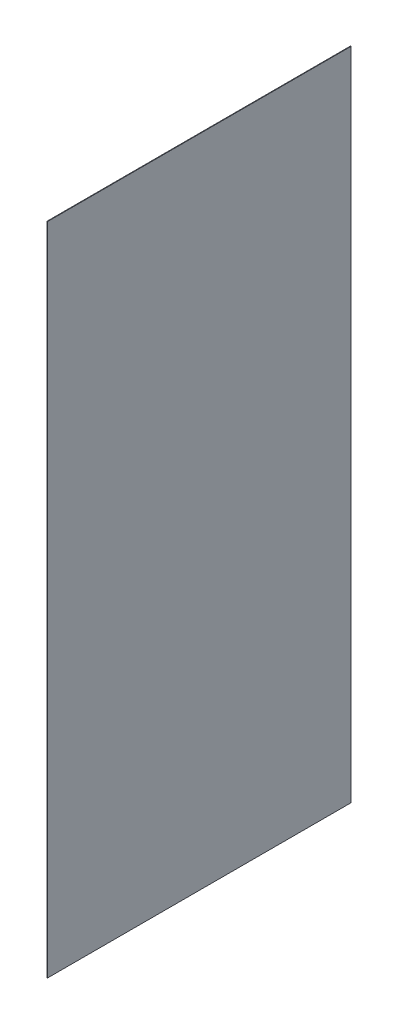
ISO-10303-21;
HEADER;
FILE_DESCRIPTION(('STEP AP214'),'2;1');
FILE_NAME('part.step','',(''),(''),'','','');
FILE_SCHEMA(('AUTOMOTIVE_DESIGN { 1 0 10303 214 1 1 1 1 }'));
ENDSEC;
DATA;
#1=APPLICATION_CONTEXT('core data for automotive mechanical design processes');
#2=APPLICATION_PROTOCOL_DEFINITION('international standard','automotive_design',2000,#1);
#3=PRODUCT_CONTEXT('',#1,'mechanical');
#4=PRODUCT('Part','Part','',(#3));
#5=PRODUCT_RELATED_PRODUCT_CATEGORY('part','',(#4));
#6=PRODUCT_DEFINITION_FORMATION('','',#4);
#7=PRODUCT_DEFINITION_CONTEXT('part definition',#1,'design');
#8=PRODUCT_DEFINITION('design','',#6,#7);
#9=PRODUCT_DEFINITION_SHAPE('','',#8);
#10=(LENGTH_UNIT() NAMED_UNIT(*) SI_UNIT(.MILLI.,.METRE.));
#11=(NAMED_UNIT(*) PLANE_ANGLE_UNIT() SI_UNIT($,.RADIAN.));
#12=(NAMED_UNIT(*) SI_UNIT($,.STERADIAN.) SOLID_ANGLE_UNIT());
#13=UNCERTAINTY_MEASURE_WITH_UNIT(LENGTH_MEASURE(1.E-05),#10,'distance_accuracy_value','');
#14=(GEOMETRIC_REPRESENTATION_CONTEXT(3) GLOBAL_UNCERTAINTY_ASSIGNED_CONTEXT((#13)) GLOBAL_UNIT_ASSIGNED_CONTEXT((#10,
#11,#12)) REPRESENTATION_CONTEXT('',''));
#15=CARTESIAN_POINT('',(0.,0.,0.));
#16=DIRECTION('',(0.,0.,1.));
#17=DIRECTION('',(1.,0.,0.));
#18=AXIS2_PLACEMENT_3D('',#15,#16,#17);
#19=CARTESIAN_POINT('',(698.5,200.,-820.));
#20=DIRECTION('',(-1.,0.,0.));
#21=DIRECTION('',(0.,0.,1.));
#22=AXIS2_PLACEMENT_3D('',#19,#20,#21);
#23=PLANE('',#22);
#24=DIRECTION('',(0.,-1.,0.));
#25=VECTOR('',#24,1.);
#26=CARTESIAN_POINT('',(698.5,200.,0.));
#27=LINE('',#26,#25);
#28=CARTESIAN_POINT('',(698.5,1970.,0.));
#29=VERTEX_POINT('',#28);
#30=CARTESIAN_POINT('',(698.5,200.,0.));
#31=VERTEX_POINT('',#30);
#32=EDGE_CURVE('E103',#29,#31,#27,.T.);
#33=ORIENTED_EDGE('',*,*,#32,.F.);
#34=DIRECTION('',(0.,0.,1.));
#35=VECTOR('',#34,1.);
#36=CARTESIAN_POINT('',(698.5,1970.,-820.));
#37=LINE('',#36,#35);
#38=CARTESIAN_POINT('',(698.5,1970.,-820.));
#39=VERTEX_POINT('',#38);
#40=EDGE_CURVE('E11',#39,#29,#37,.T.);
#41=ORIENTED_EDGE('',*,*,#40,.F.);
#42=DIRECTION('',(0.,-1.,0.));
#43=VECTOR('',#42,1.);
#44=CARTESIAN_POINT('',(698.5,200.,-820.));
#45=LINE('',#44,#43);
#46=CARTESIAN_POINT('',(698.5,200.,-820.));
#47=VERTEX_POINT('',#46);
#48=EDGE_CURVE('E97',#39,#47,#45,.T.);
#49=ORIENTED_EDGE('',*,*,#48,.T.);
#50=DIRECTION('',(0.,0.,1.));
#51=VECTOR('',#50,1.);
#52=CARTESIAN_POINT('',(698.5,200.,-820.));
#53=LINE('',#52,#51);
#54=EDGE_CURVE('E42',#47,#31,#53,.T.);
#55=ORIENTED_EDGE('',*,*,#54,.T.);
#56=EDGE_LOOP('',(#33,#41,#49,#55));
#57=FACE_BOUND('',#56,.T.);
#58=ADVANCED_FACE('F39',(#57),#23,.T.);
#59=CARTESIAN_POINT('',(698.5,1970.,-820.));
#60=DIRECTION('',(0.,1.,0.));
#61=DIRECTION('',(0.,0.,1.));
#62=AXIS2_PLACEMENT_3D('',#59,#60,#61);
#63=PLANE('',#62);
#64=DIRECTION('',(-1.,0.,0.));
#65=VECTOR('',#64,1.);
#66=CARTESIAN_POINT('',(698.5,1970.,0.));
#67=LINE('',#66,#65);
#68=CARTESIAN_POINT('',(700.,1970.,0.));
#69=VERTEX_POINT('',#68);
#70=EDGE_CURVE('E99',#69,#29,#67,.T.);
#71=ORIENTED_EDGE('',*,*,#70,.F.);
#72=DIRECTION('',(0.,0.,1.));
#73=VECTOR('',#72,1.);
#74=CARTESIAN_POINT('',(700.,1970.,-820.));
#75=LINE('',#74,#73);
#76=CARTESIAN_POINT('',(700.,1970.,-820.));
#77=VERTEX_POINT('',#76);
#78=EDGE_CURVE('E48',#77,#69,#75,.T.);
#79=ORIENTED_EDGE('',*,*,#78,.F.);
#80=DIRECTION('',(-1.,0.,0.));
#81=VECTOR('',#80,1.);
#82=CARTESIAN_POINT('',(698.5,1970.,-820.));
#83=LINE('',#82,#81);
#84=EDGE_CURVE('E94',#77,#39,#83,.T.);
#85=ORIENTED_EDGE('',*,*,#84,.T.);
#86=ORIENTED_EDGE('',*,*,#40,.T.);
#87=EDGE_LOOP('',(#71,#79,#85,#86));
#88=FACE_BOUND('',#87,.T.);
#89=ADVANCED_FACE('F113',(#88),#63,.T.);
#90=CARTESIAN_POINT('',(700.,200.,-820.));
#91=DIRECTION('',(1.,0.,0.));
#92=DIRECTION('',(0.,0.,-1.));
#93=AXIS2_PLACEMENT_3D('',#90,#91,#92);
#94=PLANE('',#93);
#95=DIRECTION('',(0.,1.,0.));
#96=VECTOR('',#95,1.);
#97=CARTESIAN_POINT('',(700.,200.,0.));
#98=LINE('',#97,#96);
#99=CARTESIAN_POINT('',(700.,200.,0.));
#100=VERTEX_POINT('',#99);
#101=EDGE_CURVE('E89',#100,#69,#98,.T.);
#102=ORIENTED_EDGE('',*,*,#101,.F.);
#103=DIRECTION('',(0.,0.,1.));
#104=VECTOR('',#103,1.);
#105=CARTESIAN_POINT('',(700.,200.,-820.));
#106=LINE('',#105,#104);
#107=CARTESIAN_POINT('',(700.,200.,-820.));
#108=VERTEX_POINT('',#107);
#109=EDGE_CURVE('E84',#108,#100,#106,.T.);
#110=ORIENTED_EDGE('',*,*,#109,.F.);
#111=DIRECTION('',(0.,1.,0.));
#112=VECTOR('',#111,1.);
#113=CARTESIAN_POINT('',(700.,200.,-820.));
#114=LINE('',#113,#112);
#115=EDGE_CURVE('E87',#108,#77,#114,.T.);
#116=ORIENTED_EDGE('',*,*,#115,.T.);
#117=ORIENTED_EDGE('',*,*,#78,.T.);
#118=EDGE_LOOP('',(#102,#110,#116,#117));
#119=FACE_BOUND('',#118,.T.);
#120=ADVANCED_FACE('F86',(#119),#94,.T.);
#121=CARTESIAN_POINT('',(698.5,200.,-820.));
#122=DIRECTION('',(0.,-1.,0.));
#123=DIRECTION('',(0.,0.,-1.));
#124=AXIS2_PLACEMENT_3D('',#121,#122,#123);
#125=PLANE('',#124);
#126=DIRECTION('',(1.,0.,0.));
#127=VECTOR('',#126,1.);
#128=CARTESIAN_POINT('',(698.5,200.,0.));
#129=LINE('',#128,#127);
#130=EDGE_CURVE('E106',#31,#100,#129,.T.);
#131=ORIENTED_EDGE('',*,*,#130,.F.);
#132=ORIENTED_EDGE('',*,*,#54,.F.);
#133=DIRECTION('',(1.,0.,0.));
#134=VECTOR('',#133,1.);
#135=CARTESIAN_POINT('',(698.5,200.,-820.));
#136=LINE('',#135,#134);
#137=EDGE_CURVE('E93',#47,#108,#136,.T.);
#138=ORIENTED_EDGE('',*,*,#137,.T.);
#139=ORIENTED_EDGE('',*,*,#109,.T.);
#140=EDGE_LOOP('',(#131,#132,#138,#139));
#141=FACE_BOUND('',#140,.T.);
#142=ADVANCED_FACE('F96',(#141),#125,.T.);
#143=CARTESIAN_POINT('',(0.,0.,-820.));
#144=DIRECTION('',(0.,0.,-1.));
#145=DIRECTION('',(-1.,0.,0.));
#146=AXIS2_PLACEMENT_3D('',#143,#144,#145);
#147=PLANE('',#146);
#148=ORIENTED_EDGE('',*,*,#48,.F.);
#149=ORIENTED_EDGE('',*,*,#84,.F.);
#150=ORIENTED_EDGE('',*,*,#115,.F.);
#151=ORIENTED_EDGE('',*,*,#137,.F.);
#152=EDGE_LOOP('',(#148,#149,#150,#151));
#153=FACE_BOUND('',#152,.T.);
#154=ADVANCED_FACE('F92',(#153),#147,.T.);
#155=CARTESIAN_POINT('',(0.,0.,0.));
#156=DIRECTION('',(0.,0.,-1.));
#157=DIRECTION('',(-1.,0.,0.));
#158=AXIS2_PLACEMENT_3D('',#155,#156,#157);
#159=PLANE('',#158);
#160=ORIENTED_EDGE('',*,*,#32,.T.);
#161=ORIENTED_EDGE('',*,*,#130,.T.);
#162=ORIENTED_EDGE('',*,*,#101,.T.);
#163=ORIENTED_EDGE('',*,*,#70,.T.);
#164=EDGE_LOOP('',(#160,#161,#162,#163));
#165=FACE_BOUND('',#164,.T.);
#166=ADVANCED_FACE('F112',(#165),#159,.F.);
#167=CLOSED_SHELL('',(#58,#89,#120,#142,#154,#166));
#168=MANIFOLD_SOLID_BREP('B2',#167);
#169=ADVANCED_BREP_SHAPE_REPRESENTATION('',(#18,#168),#14);
#170=SHAPE_DEFINITION_REPRESENTATION(#9,#169);
ENDSEC;
END-ISO-10303-21;
